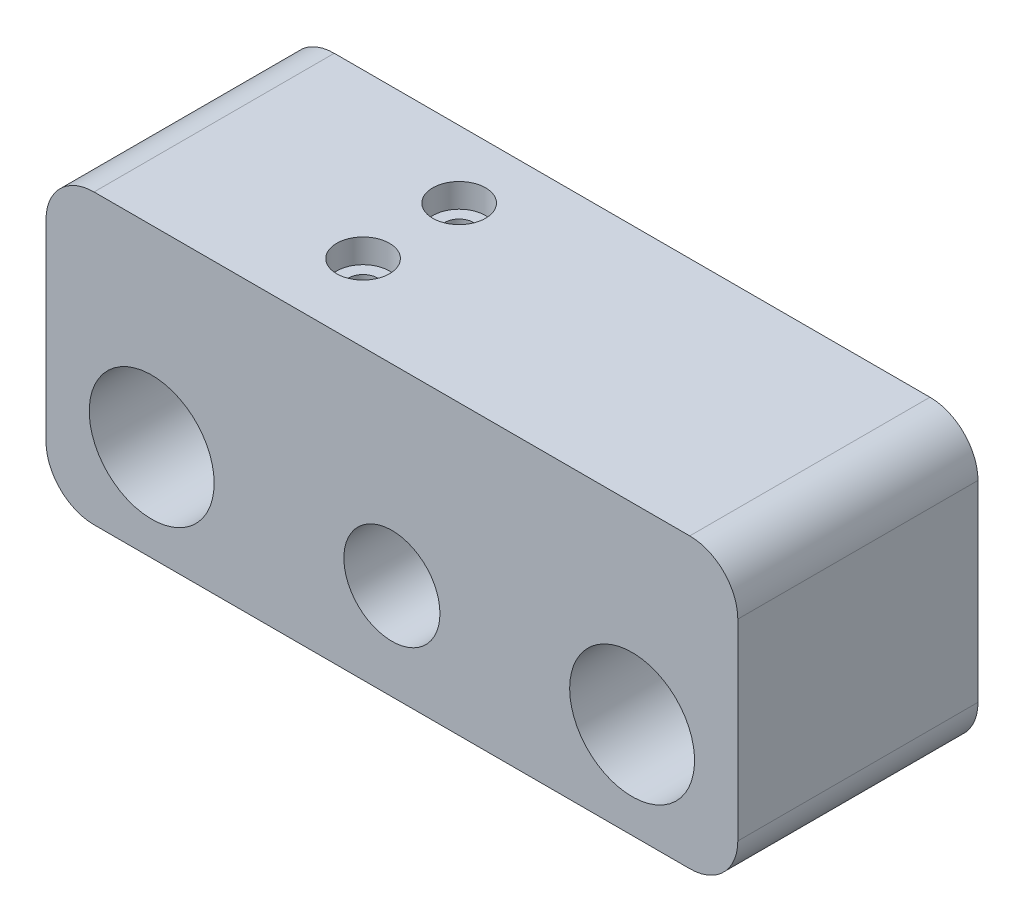
ISO-10303-21;
HEADER;
FILE_DESCRIPTION(('STEP AP214'),'2;1');
FILE_NAME('part.step','',(''),(''),'','','');
FILE_SCHEMA(('AUTOMOTIVE_DESIGN { 1 0 10303 214 1 1 1 1 }'));
ENDSEC;
DATA;
#1=APPLICATION_CONTEXT('core data for automotive mechanical design processes');
#2=APPLICATION_PROTOCOL_DEFINITION('international standard','automotive_design',2000,#1);
#3=PRODUCT_CONTEXT('',#1,'mechanical');
#4=PRODUCT('Part','Part','',(#3));
#5=PRODUCT_RELATED_PRODUCT_CATEGORY('part','',(#4));
#6=PRODUCT_DEFINITION_FORMATION('','',#4);
#7=PRODUCT_DEFINITION_CONTEXT('part definition',#1,'design');
#8=PRODUCT_DEFINITION('design','',#6,#7);
#9=PRODUCT_DEFINITION_SHAPE('','',#8);
#10=(LENGTH_UNIT() NAMED_UNIT(*) SI_UNIT(.MILLI.,.METRE.));
#11=(NAMED_UNIT(*) PLANE_ANGLE_UNIT() SI_UNIT($,.RADIAN.));
#12=(NAMED_UNIT(*) SI_UNIT($,.STERADIAN.) SOLID_ANGLE_UNIT());
#13=UNCERTAINTY_MEASURE_WITH_UNIT(LENGTH_MEASURE(1.E-05),#10,'distance_accuracy_value','');
#14=(GEOMETRIC_REPRESENTATION_CONTEXT(3) GLOBAL_UNCERTAINTY_ASSIGNED_CONTEXT((#13)) GLOBAL_UNIT_ASSIGNED_CONTEXT((#10,
#11,#12)) REPRESENTATION_CONTEXT('',''));
#15=CARTESIAN_POINT('',(0.,0.,0.));
#16=DIRECTION('',(0.,0.,1.));
#17=DIRECTION('',(1.,0.,0.));
#18=AXIS2_PLACEMENT_3D('',#15,#16,#17);
#19=CARTESIAN_POINT('',(-22.,40.001,14.));
#20=DIRECTION('',(0.,-1.,0.));
#21=DIRECTION('',(0.,0.,-1.));
#22=AXIS2_PLACEMENT_3D('',#19,#20,#21);
#23=CYLINDRICAL_SURFACE('',#22,3.);
#24=CARTESIAN_POINT('',(-22.,-20.,14.));
#25=DIRECTION('',(0.,-1.,0.));
#26=DIRECTION('',(0.,0.,-1.));
#27=AXIS2_PLACEMENT_3D('',#24,#25,#26);
#28=CIRCLE('',#27,3.);
#29=CARTESIAN_POINT('',(-22.,-20.,11.));
#30=VERTEX_POINT('',#29);
#31=EDGE_CURVE('E190',#30,#30,#28,.T.);
#32=ORIENTED_EDGE('',*,*,#31,.T.);
#33=EDGE_LOOP('',(#32));
#34=FACE_BOUND('',#33,.T.);
#35=CARTESIAN_POINT('',(-22.,35.,14.));
#36=DIRECTION('',(0.,1.,0.));
#37=DIRECTION('',(0.,0.,1.));
#38=AXIS2_PLACEMENT_3D('',#35,#36,#37);
#39=CIRCLE('',#38,3.);
#40=CARTESIAN_POINT('',(-22.,35.,17.));
#41=VERTEX_POINT('',#40);
#42=EDGE_CURVE('E38',#41,#41,#39,.F.);
#43=ORIENTED_EDGE('',*,*,#42,.F.);
#44=EDGE_LOOP('',(#43));
#45=FACE_BOUND('',#44,.T.);
#46=ADVANCED_FACE('F34',(#34,#45),#23,.F.);
#47=CARTESIAN_POINT('',(-22.,40.001,34.));
#48=DIRECTION('',(0.,-1.,0.));
#49=DIRECTION('',(0.,0.,-1.));
#50=AXIS2_PLACEMENT_3D('',#47,#48,#49);
#51=CYLINDRICAL_SURFACE('',#50,3.);
#52=CARTESIAN_POINT('',(-22.,-20.,34.));
#53=DIRECTION('',(0.,-1.,0.));
#54=DIRECTION('',(0.,0.,-1.));
#55=AXIS2_PLACEMENT_3D('',#52,#53,#54);
#56=CIRCLE('',#55,3.);
#57=CARTESIAN_POINT('',(-22.,-20.,31.));
#58=VERTEX_POINT('',#57);
#59=EDGE_CURVE('E125',#58,#58,#56,.T.);
#60=ORIENTED_EDGE('',*,*,#59,.T.);
#61=EDGE_LOOP('',(#60));
#62=FACE_BOUND('',#61,.T.);
#63=CARTESIAN_POINT('',(-22.,35.,34.));
#64=DIRECTION('',(0.,1.,0.));
#65=DIRECTION('',(0.,0.,1.));
#66=AXIS2_PLACEMENT_3D('',#63,#64,#65);
#67=CIRCLE('',#66,3.);
#68=CARTESIAN_POINT('',(-22.,35.,37.));
#69=VERTEX_POINT('',#68);
#70=EDGE_CURVE('E184',#69,#69,#67,.F.);
#71=ORIENTED_EDGE('',*,*,#70,.F.);
#72=EDGE_LOOP('',(#71));
#73=FACE_BOUND('',#72,.T.);
#74=ADVANCED_FACE('F230',(#62,#73),#51,.F.);
#75=CARTESIAN_POINT('',(-62.,-10.,50.));
#76=DIRECTION('',(0.,0.,1.));
#77=DIRECTION('',(1.,0.,0.));
#78=AXIS2_PLACEMENT_3D('',#75,#76,#77);
#79=CYLINDRICAL_SURFACE('',#78,10.);
#80=DIRECTION('',(0.,0.,1.));
#81=VECTOR('',#80,1.);
#82=CARTESIAN_POINT('',(-72.,-10.,50.));
#83=LINE('',#82,#81);
#84=CARTESIAN_POINT('',(-72.,-10.,0.));
#85=VERTEX_POINT('',#84);
#86=CARTESIAN_POINT('',(-72.,-10.,50.));
#87=VERTEX_POINT('',#86);
#88=EDGE_CURVE('E179',#85,#87,#83,.T.);
#89=ORIENTED_EDGE('',*,*,#88,.F.);
#90=CARTESIAN_POINT('',(-62.,-10.,0.));
#91=DIRECTION('',(0.,0.,-1.));
#92=DIRECTION('',(-1.,0.,0.));
#93=AXIS2_PLACEMENT_3D('',#90,#91,#92);
#94=CIRCLE('',#93,10.);
#95=CARTESIAN_POINT('',(-62.,-20.,0.));
#96=VERTEX_POINT('',#95);
#97=EDGE_CURVE('E43',#96,#85,#94,.T.);
#98=ORIENTED_EDGE('',*,*,#97,.F.);
#99=DIRECTION('',(0.,0.,1.));
#100=VECTOR('',#99,1.);
#101=CARTESIAN_POINT('',(-62.,-20.,-0.001000000000001));
#102=LINE('',#101,#100);
#103=CARTESIAN_POINT('',(-62.,-20.,50.));
#104=VERTEX_POINT('',#103);
#105=EDGE_CURVE('E182',#104,#96,#102,.F.);
#106=ORIENTED_EDGE('',*,*,#105,.F.);
#107=CARTESIAN_POINT('',(-62.,-10.,50.));
#108=DIRECTION('',(0.,0.,-1.));
#109=DIRECTION('',(-1.,0.,0.));
#110=AXIS2_PLACEMENT_3D('',#107,#108,#109);
#111=CIRCLE('',#110,10.);
#112=EDGE_CURVE('E11',#87,#104,#111,.F.);
#113=ORIENTED_EDGE('',*,*,#112,.F.);
#114=EDGE_LOOP('',(#89,#98,#106,#113));
#115=FACE_BOUND('',#114,.T.);
#116=ADVANCED_FACE('F36',(#115),#79,.T.);
#117=CARTESIAN_POINT('',(-62.,30.,50.));
#118=DIRECTION('',(0.,0.,1.));
#119=DIRECTION('',(1.,0.,0.));
#120=AXIS2_PLACEMENT_3D('',#117,#118,#119);
#121=CYLINDRICAL_SURFACE('',#120,10.);
#122=DIRECTION('',(0.,0.,1.));
#123=VECTOR('',#122,1.);
#124=CARTESIAN_POINT('',(-62.,40.,50.));
#125=LINE('',#124,#123);
#126=CARTESIAN_POINT('',(-62.,40.,0.));
#127=VERTEX_POINT('',#126);
#128=CARTESIAN_POINT('',(-62.,40.,50.));
#129=VERTEX_POINT('',#128);
#130=EDGE_CURVE('E169',#127,#129,#125,.T.);
#131=ORIENTED_EDGE('',*,*,#130,.F.);
#132=CARTESIAN_POINT('',(-62.,30.,0.));
#133=DIRECTION('',(0.,0.,-1.));
#134=DIRECTION('',(-1.,0.,0.));
#135=AXIS2_PLACEMENT_3D('',#132,#133,#134);
#136=CIRCLE('',#135,10.);
#137=CARTESIAN_POINT('',(-72.,30.,0.));
#138=VERTEX_POINT('',#137);
#139=EDGE_CURVE('E175',#138,#127,#136,.T.);
#140=ORIENTED_EDGE('',*,*,#139,.F.);
#141=DIRECTION('',(0.,0.,1.));
#142=VECTOR('',#141,1.);
#143=CARTESIAN_POINT('',(-72.,30.,50.));
#144=LINE('',#143,#142);
#145=CARTESIAN_POINT('',(-72.,30.,50.));
#146=VERTEX_POINT('',#145);
#147=EDGE_CURVE('E172',#146,#138,#144,.F.);
#148=ORIENTED_EDGE('',*,*,#147,.F.);
#149=CARTESIAN_POINT('',(-62.,30.,50.));
#150=DIRECTION('',(0.,0.,-1.));
#151=DIRECTION('',(-1.,0.,0.));
#152=AXIS2_PLACEMENT_3D('',#149,#150,#151);
#153=CIRCLE('',#152,10.);
#154=EDGE_CURVE('E177',#129,#146,#153,.F.);
#155=ORIENTED_EDGE('',*,*,#154,.F.);
#156=EDGE_LOOP('',(#131,#140,#148,#155));
#157=FACE_BOUND('',#156,.T.);
#158=ADVANCED_FACE('F287',(#157),#121,.T.);
#159=CARTESIAN_POINT('',(62.,30.,50.));
#160=DIRECTION('',(0.,0.,1.));
#161=DIRECTION('',(1.,0.,0.));
#162=AXIS2_PLACEMENT_3D('',#159,#160,#161);
#163=CYLINDRICAL_SURFACE('',#162,10.);
#164=DIRECTION('',(0.,0.,1.));
#165=VECTOR('',#164,1.);
#166=CARTESIAN_POINT('',(72.,30.,50.));
#167=LINE('',#166,#165);
#168=CARTESIAN_POINT('',(72.,30.,0.));
#169=VERTEX_POINT('',#168);
#170=CARTESIAN_POINT('',(72.,30.,50.));
#171=VERTEX_POINT('',#170);
#172=EDGE_CURVE('E108',#169,#171,#167,.T.);
#173=ORIENTED_EDGE('',*,*,#172,.F.);
#174=CARTESIAN_POINT('',(62.,30.,0.));
#175=DIRECTION('',(0.,0.,-1.));
#176=DIRECTION('',(-1.,0.,0.));
#177=AXIS2_PLACEMENT_3D('',#174,#175,#176);
#178=CIRCLE('',#177,10.);
#179=CARTESIAN_POINT('',(62.,40.,0.));
#180=VERTEX_POINT('',#179);
#181=EDGE_CURVE('E165',#180,#169,#178,.T.);
#182=ORIENTED_EDGE('',*,*,#181,.F.);
#183=DIRECTION('',(0.,0.,1.));
#184=VECTOR('',#183,1.);
#185=CARTESIAN_POINT('',(62.,40.,50.));
#186=LINE('',#185,#184);
#187=CARTESIAN_POINT('',(62.,40.,50.));
#188=VERTEX_POINT('',#187);
#189=EDGE_CURVE('E162',#188,#180,#186,.F.);
#190=ORIENTED_EDGE('',*,*,#189,.F.);
#191=CARTESIAN_POINT('',(62.,30.,50.));
#192=DIRECTION('',(0.,0.,-1.));
#193=DIRECTION('',(-1.,0.,0.));
#194=AXIS2_PLACEMENT_3D('',#191,#192,#193);
#195=CIRCLE('',#194,10.);
#196=EDGE_CURVE('E167',#171,#188,#195,.F.);
#197=ORIENTED_EDGE('',*,*,#196,.F.);
#198=EDGE_LOOP('',(#173,#182,#190,#197));
#199=FACE_BOUND('',#198,.T.);
#200=ADVANCED_FACE('F295',(#199),#163,.T.);
#201=CARTESIAN_POINT('',(62.,-10.,-0.001000000000001));
#202=DIRECTION('',(0.,0.,1.));
#203=DIRECTION('',(1.,0.,0.));
#204=AXIS2_PLACEMENT_3D('',#201,#202,#203);
#205=CYLINDRICAL_SURFACE('',#204,10.);
#206=DIRECTION('',(0.,0.,1.));
#207=VECTOR('',#206,1.);
#208=CARTESIAN_POINT('',(62.,-20.,-0.001000000000001));
#209=LINE('',#208,#207);
#210=CARTESIAN_POINT('',(62.,-20.,0.));
#211=VERTEX_POINT('',#210);
#212=CARTESIAN_POINT('',(62.,-20.,50.));
#213=VERTEX_POINT('',#212);
#214=EDGE_CURVE('E102',#211,#213,#209,.T.);
#215=ORIENTED_EDGE('',*,*,#214,.F.);
#216=CARTESIAN_POINT('',(62.,-10.,0.));
#217=DIRECTION('',(0.,0.,-1.));
#218=DIRECTION('',(-1.,0.,0.));
#219=AXIS2_PLACEMENT_3D('',#216,#217,#218);
#220=CIRCLE('',#219,10.);
#221=CARTESIAN_POINT('',(72.,-10.,0.));
#222=VERTEX_POINT('',#221);
#223=EDGE_CURVE('E109',#222,#211,#220,.T.);
#224=ORIENTED_EDGE('',*,*,#223,.F.);
#225=DIRECTION('',(0.,0.,1.));
#226=VECTOR('',#225,1.);
#227=CARTESIAN_POINT('',(72.,-10.,50.));
#228=LINE('',#227,#226);
#229=CARTESIAN_POINT('',(72.,-10.,50.));
#230=VERTEX_POINT('',#229);
#231=EDGE_CURVE('E105',#230,#222,#228,.F.);
#232=ORIENTED_EDGE('',*,*,#231,.F.);
#233=CARTESIAN_POINT('',(62.,-10.,50.));
#234=DIRECTION('',(0.,0.,-1.));
#235=DIRECTION('',(-1.,0.,0.));
#236=AXIS2_PLACEMENT_3D('',#233,#234,#235);
#237=CIRCLE('',#236,10.);
#238=EDGE_CURVE('E99',#213,#230,#237,.F.);
#239=ORIENTED_EDGE('',*,*,#238,.F.);
#240=EDGE_LOOP('',(#215,#224,#232,#239));
#241=FACE_BOUND('',#240,.T.);
#242=ADVANCED_FACE('F101',(#241),#205,.T.);
#243=CARTESIAN_POINT('',(72.,-40.,50.));
#244=DIRECTION('',(-1.,0.,0.));
#245=DIRECTION('',(0.,0.,1.));
#246=AXIS2_PLACEMENT_3D('',#243,#244,#245);
#247=PLANE('',#246);
#248=DIRECTION('',(0.,1.,0.));
#249=VECTOR('',#248,1.);
#250=CARTESIAN_POINT('',(72.,-40.,0.));
#251=LINE('',#250,#249);
#252=EDGE_CURVE('E141',#222,#169,#251,.T.);
#253=ORIENTED_EDGE('',*,*,#252,.T.);
#254=ORIENTED_EDGE('',*,*,#172,.T.);
#255=DIRECTION('',(0.,1.,0.));
#256=VECTOR('',#255,1.);
#257=CARTESIAN_POINT('',(72.,-40.,50.));
#258=LINE('',#257,#256);
#259=EDGE_CURVE('E144',#230,#171,#258,.T.);
#260=ORIENTED_EDGE('',*,*,#259,.F.);
#261=ORIENTED_EDGE('',*,*,#231,.T.);
#262=EDGE_LOOP('',(#253,#254,#260,#261));
#263=FACE_BOUND('',#262,.T.);
#264=ADVANCED_FACE('F312',(#263),#247,.F.);
#265=CARTESIAN_POINT('',(-72.,40.,50.));
#266=DIRECTION('',(0.,-1.,0.));
#267=DIRECTION('',(0.,0.,-1.));
#268=AXIS2_PLACEMENT_3D('',#265,#266,#267);
#269=PLANE('',#268);
#270=CARTESIAN_POINT('',(-22.,40.,14.));
#271=DIRECTION('',(0.,1.,0.));
#272=DIRECTION('',(0.,0.,1.));
#273=AXIS2_PLACEMENT_3D('',#270,#271,#272);
#274=CIRCLE('',#273,5.5);
#275=CARTESIAN_POINT('',(-22.,40.,19.5));
#276=VERTEX_POINT('',#275);
#277=EDGE_CURVE('E192',#276,#276,#274,.T.);
#278=ORIENTED_EDGE('',*,*,#277,.F.);
#279=EDGE_LOOP('',(#278));
#280=FACE_BOUND('',#279,.T.);
#281=CARTESIAN_POINT('',(-22.,40.,34.));
#282=DIRECTION('',(0.,1.,0.));
#283=DIRECTION('',(0.,0.,1.));
#284=AXIS2_PLACEMENT_3D('',#281,#282,#283);
#285=CIRCLE('',#284,5.5);
#286=CARTESIAN_POINT('',(-22.,40.,39.5));
#287=VERTEX_POINT('',#286);
#288=EDGE_CURVE('E202',#287,#287,#285,.T.);
#289=ORIENTED_EDGE('',*,*,#288,.F.);
#290=EDGE_LOOP('',(#289));
#291=FACE_BOUND('',#290,.T.);
#292=DIRECTION('',(-1.,0.,0.));
#293=VECTOR('',#292,1.);
#294=CARTESIAN_POINT('',(-72.,40.,0.));
#295=LINE('',#294,#293);
#296=EDGE_CURVE('E153',#180,#127,#295,.T.);
#297=ORIENTED_EDGE('',*,*,#296,.T.);
#298=ORIENTED_EDGE('',*,*,#130,.T.);
#299=DIRECTION('',(-1.,0.,0.));
#300=VECTOR('',#299,1.);
#301=CARTESIAN_POINT('',(-72.,40.,50.));
#302=LINE('',#301,#300);
#303=EDGE_CURVE('E146',#188,#129,#302,.T.);
#304=ORIENTED_EDGE('',*,*,#303,.F.);
#305=ORIENTED_EDGE('',*,*,#189,.T.);
#306=EDGE_LOOP('',(#297,#298,#304,#305));
#307=FACE_BOUND('',#306,.T.);
#308=ADVANCED_FACE('F362',(#280,#291,#307),#269,.F.);
#309=CARTESIAN_POINT('',(-72.,-40.,50.));
#310=DIRECTION('',(1.,0.,0.));
#311=DIRECTION('',(0.,0.,-1.));
#312=AXIS2_PLACEMENT_3D('',#309,#310,#311);
#313=PLANE('',#312);
#314=DIRECTION('',(0.,-1.,0.));
#315=VECTOR('',#314,1.);
#316=CARTESIAN_POINT('',(-72.,-40.,0.));
#317=LINE('',#316,#315);
#318=EDGE_CURVE('E147',#138,#85,#317,.T.);
#319=ORIENTED_EDGE('',*,*,#318,.T.);
#320=ORIENTED_EDGE('',*,*,#88,.T.);
#321=DIRECTION('',(0.,-1.,0.));
#322=VECTOR('',#321,1.);
#323=CARTESIAN_POINT('',(-72.,-40.,50.));
#324=LINE('',#323,#322);
#325=EDGE_CURVE('E117',#146,#87,#324,.T.);
#326=ORIENTED_EDGE('',*,*,#325,.F.);
#327=ORIENTED_EDGE('',*,*,#147,.T.);
#328=EDGE_LOOP('',(#319,#320,#326,#327));
#329=FACE_BOUND('',#328,.T.);
#330=ADVANCED_FACE('F354',(#329),#313,.F.);
#331=CARTESIAN_POINT('',(0.,0.,50.));
#332=DIRECTION('',(0.,0.,-1.));
#333=DIRECTION('',(-1.,0.,0.));
#334=AXIS2_PLACEMENT_3D('',#331,#332,#333);
#335=PLANE('',#334);
#336=CARTESIAN_POINT('',(50.,0.,50.));
#337=DIRECTION('',(0.,0.,1.));
#338=DIRECTION('',(-1.,0.,0.));
#339=AXIS2_PLACEMENT_3D('',#336,#337,#338);
#340=CIRCLE('',#339,13.);
#341=CARTESIAN_POINT('',(37.,0.,50.));
#342=VERTEX_POINT('',#341);
#343=EDGE_CURVE('E123',#342,#342,#340,.T.);
#344=ORIENTED_EDGE('',*,*,#343,.F.);
#345=EDGE_LOOP('',(#344));
#346=FACE_BOUND('',#345,.T.);
#347=CARTESIAN_POINT('',(-50.,0.,50.));
#348=DIRECTION('',(0.,0.,1.));
#349=DIRECTION('',(1.,0.,0.));
#350=AXIS2_PLACEMENT_3D('',#347,#348,#349);
#351=CIRCLE('',#350,13.);
#352=CARTESIAN_POINT('',(-37.,0.,50.));
#353=VERTEX_POINT('',#352);
#354=EDGE_CURVE('E129',#353,#353,#351,.T.);
#355=ORIENTED_EDGE('',*,*,#354,.F.);
#356=EDGE_LOOP('',(#355));
#357=FACE_BOUND('',#356,.T.);
#358=CARTESIAN_POINT('',(0.,0.,50.));
#359=DIRECTION('',(0.,0.,1.));
#360=DIRECTION('',(1.,0.,0.));
#361=AXIS2_PLACEMENT_3D('',#358,#359,#360);
#362=CIRCLE('',#361,10.);
#363=CARTESIAN_POINT('',(10.,0.,50.));
#364=VERTEX_POINT('',#363);
#365=EDGE_CURVE('E138',#364,#364,#362,.T.);
#366=ORIENTED_EDGE('',*,*,#365,.F.);
#367=EDGE_LOOP('',(#366));
#368=FACE_BOUND('',#367,.T.);
#369=ORIENTED_EDGE('',*,*,#325,.T.);
#370=ORIENTED_EDGE('',*,*,#112,.T.);
#371=DIRECTION('',(-1.,0.,0.));
#372=VECTOR('',#371,1.);
#373=CARTESIAN_POINT('',(-72.,-20.,50.));
#374=LINE('',#373,#372);
#375=EDGE_CURVE('E114',#213,#104,#374,.T.);
#376=ORIENTED_EDGE('',*,*,#375,.F.);
#377=ORIENTED_EDGE('',*,*,#238,.T.);
#378=ORIENTED_EDGE('',*,*,#259,.T.);
#379=ORIENTED_EDGE('',*,*,#196,.T.);
#380=ORIENTED_EDGE('',*,*,#303,.T.);
#381=ORIENTED_EDGE('',*,*,#154,.T.);
#382=EDGE_LOOP('',(#369,#370,#376,#377,#378,#379,#380,#381));
#383=FACE_BOUND('',#382,.T.);
#384=ADVANCED_FACE('F119',(#346,#357,#368,#383),#335,.F.);
#385=CARTESIAN_POINT('',(0.,0.,0.));
#386=DIRECTION('',(0.,0.,-1.));
#387=DIRECTION('',(-1.,0.,0.));
#388=AXIS2_PLACEMENT_3D('',#385,#386,#387);
#389=PLANE('',#388);
#390=DIRECTION('',(-1.,0.,0.));
#391=VECTOR('',#390,1.);
#392=CARTESIAN_POINT('',(-72.,-20.,0.));
#393=LINE('',#392,#391);
#394=EDGE_CURVE('E116',#211,#96,#393,.T.);
#395=ORIENTED_EDGE('',*,*,#394,.T.);
#396=ORIENTED_EDGE('',*,*,#97,.T.);
#397=ORIENTED_EDGE('',*,*,#318,.F.);
#398=ORIENTED_EDGE('',*,*,#139,.T.);
#399=ORIENTED_EDGE('',*,*,#296,.F.);
#400=ORIENTED_EDGE('',*,*,#181,.T.);
#401=ORIENTED_EDGE('',*,*,#252,.F.);
#402=ORIENTED_EDGE('',*,*,#223,.T.);
#403=EDGE_LOOP('',(#395,#396,#397,#398,#399,#400,#401,#402));
#404=FACE_BOUND('',#403,.T.);
#405=CARTESIAN_POINT('',(50.,0.,0.));
#406=DIRECTION('',(0.,0.,-1.));
#407=DIRECTION('',(-1.,0.,0.));
#408=AXIS2_PLACEMENT_3D('',#405,#406,#407);
#409=CIRCLE('',#408,13.);
#410=CARTESIAN_POINT('',(37.,0.,0.));
#411=VERTEX_POINT('',#410);
#412=EDGE_CURVE('E120',#411,#411,#409,.F.);
#413=ORIENTED_EDGE('',*,*,#412,.T.);
#414=EDGE_LOOP('',(#413));
#415=FACE_BOUND('',#414,.T.);
#416=CARTESIAN_POINT('',(-50.,0.,0.));
#417=DIRECTION('',(0.,0.,-1.));
#418=DIRECTION('',(-1.,0.,0.));
#419=AXIS2_PLACEMENT_3D('',#416,#417,#418);
#420=CIRCLE('',#419,13.);
#421=CARTESIAN_POINT('',(-63.,0.,0.));
#422=VERTEX_POINT('',#421);
#423=EDGE_CURVE('E133',#422,#422,#420,.F.);
#424=ORIENTED_EDGE('',*,*,#423,.T.);
#425=EDGE_LOOP('',(#424));
#426=FACE_BOUND('',#425,.T.);
#427=CARTESIAN_POINT('',(0.,0.,0.));
#428=DIRECTION('',(0.,0.,-1.));
#429=DIRECTION('',(-1.,0.,0.));
#430=AXIS2_PLACEMENT_3D('',#427,#428,#429);
#431=CIRCLE('',#430,10.);
#432=CARTESIAN_POINT('',(-10.,0.,0.));
#433=VERTEX_POINT('',#432);
#434=EDGE_CURVE('E132',#433,#433,#431,.F.);
#435=ORIENTED_EDGE('',*,*,#434,.T.);
#436=EDGE_LOOP('',(#435));
#437=FACE_BOUND('',#436,.T.);
#438=ADVANCED_FACE('F338',(#404,#415,#426,#437),#389,.T.);
#439=CARTESIAN_POINT('',(0.,0.,-0.001000000000001));
#440=DIRECTION('',(0.,0.,1.));
#441=DIRECTION('',(1.,0.,0.));
#442=AXIS2_PLACEMENT_3D('',#439,#440,#441);
#443=CYLINDRICAL_SURFACE('',#442,10.);
#444=ORIENTED_EDGE('',*,*,#434,.F.);
#445=EDGE_LOOP('',(#444));
#446=FACE_BOUND('',#445,.T.);
#447=ORIENTED_EDGE('',*,*,#365,.T.);
#448=EDGE_LOOP('',(#447));
#449=FACE_BOUND('',#448,.T.);
#450=ADVANCED_FACE('F330',(#446,#449),#443,.F.);
#451=CARTESIAN_POINT('',(-50.,0.,-0.001000000000001));
#452=DIRECTION('',(0.,0.,1.));
#453=DIRECTION('',(1.,0.,0.));
#454=AXIS2_PLACEMENT_3D('',#451,#452,#453);
#455=CYLINDRICAL_SURFACE('',#454,13.);
#456=ORIENTED_EDGE('',*,*,#423,.F.);
#457=EDGE_LOOP('',(#456));
#458=FACE_BOUND('',#457,.T.);
#459=ORIENTED_EDGE('',*,*,#354,.T.);
#460=EDGE_LOOP('',(#459));
#461=FACE_BOUND('',#460,.T.);
#462=ADVANCED_FACE('F223',(#458,#461),#455,.F.);
#463=CARTESIAN_POINT('',(50.,0.,-0.001000000000001));
#464=DIRECTION('',(0.,0.,1.));
#465=DIRECTION('',(1.,0.,0.));
#466=AXIS2_PLACEMENT_3D('',#463,#464,#465);
#467=CYLINDRICAL_SURFACE('',#466,13.);
#468=ORIENTED_EDGE('',*,*,#412,.F.);
#469=EDGE_LOOP('',(#468));
#470=FACE_BOUND('',#469,.T.);
#471=ORIENTED_EDGE('',*,*,#343,.T.);
#472=EDGE_LOOP('',(#471));
#473=FACE_BOUND('',#472,.T.);
#474=ADVANCED_FACE('F213',(#470,#473),#467,.F.);
#475=CARTESIAN_POINT('',(-72.,-20.,-0.001000000000001));
#476=DIRECTION('',(0.,1.,0.));
#477=DIRECTION('',(0.,0.,1.));
#478=AXIS2_PLACEMENT_3D('',#475,#476,#477);
#479=PLANE('',#478);
#480=ORIENTED_EDGE('',*,*,#59,.F.);
#481=EDGE_LOOP('',(#480));
#482=FACE_BOUND('',#481,.T.);
#483=ORIENTED_EDGE('',*,*,#31,.F.);
#484=EDGE_LOOP('',(#483));
#485=FACE_BOUND('',#484,.T.);
#486=ORIENTED_EDGE('',*,*,#375,.T.);
#487=ORIENTED_EDGE('',*,*,#105,.T.);
#488=ORIENTED_EDGE('',*,*,#394,.F.);
#489=ORIENTED_EDGE('',*,*,#214,.T.);
#490=EDGE_LOOP('',(#486,#487,#488,#489));
#491=FACE_BOUND('',#490,.T.);
#492=ADVANCED_FACE('F113',(#482,#485,#491),#479,.F.);
#493=CARTESIAN_POINT('',(-22.,35.,34.));
#494=DIRECTION('',(0.,1.,0.));
#495=DIRECTION('',(0.,0.,1.));
#496=AXIS2_PLACEMENT_3D('',#493,#494,#495);
#497=PLANE('',#496);
#498=CARTESIAN_POINT('',(-22.,35.,34.));
#499=DIRECTION('',(0.,1.,0.));
#500=DIRECTION('',(0.,0.,1.));
#501=AXIS2_PLACEMENT_3D('',#498,#499,#500);
#502=CIRCLE('',#501,5.5);
#503=CARTESIAN_POINT('',(-22.,35.,39.5));
#504=VERTEX_POINT('',#503);
#505=EDGE_CURVE('E197',#504,#504,#502,.T.);
#506=ORIENTED_EDGE('',*,*,#505,.T.);
#507=EDGE_LOOP('',(#506));
#508=FACE_BOUND('',#507,.T.);
#509=ORIENTED_EDGE('',*,*,#70,.T.);
#510=EDGE_LOOP('',(#509));
#511=FACE_BOUND('',#510,.T.);
#512=ADVANCED_FACE('F212',(#508,#511),#497,.T.);
#513=CARTESIAN_POINT('',(-22.,35.,34.));
#514=DIRECTION('',(0.,1.,0.));
#515=DIRECTION('',(0.,0.,1.));
#516=AXIS2_PLACEMENT_3D('',#513,#514,#515);
#517=CYLINDRICAL_SURFACE('',#516,5.5);
#518=ORIENTED_EDGE('',*,*,#505,.F.);
#519=EDGE_LOOP('',(#518));
#520=FACE_BOUND('',#519,.T.);
#521=ORIENTED_EDGE('',*,*,#288,.T.);
#522=EDGE_LOOP('',(#521));
#523=FACE_BOUND('',#522,.T.);
#524=ADVANCED_FACE('F220',(#520,#523),#517,.F.);
#525=CARTESIAN_POINT('',(-22.,35.,14.));
#526=DIRECTION('',(0.,1.,0.));
#527=DIRECTION('',(0.,0.,1.));
#528=AXIS2_PLACEMENT_3D('',#525,#526,#527);
#529=PLANE('',#528);
#530=CARTESIAN_POINT('',(-22.,35.,14.));
#531=DIRECTION('',(0.,1.,0.));
#532=DIRECTION('',(0.,0.,1.));
#533=AXIS2_PLACEMENT_3D('',#530,#531,#532);
#534=CIRCLE('',#533,5.5);
#535=CARTESIAN_POINT('',(-22.,35.,19.5));
#536=VERTEX_POINT('',#535);
#537=EDGE_CURVE('E186',#536,#536,#534,.T.);
#538=ORIENTED_EDGE('',*,*,#537,.T.);
#539=EDGE_LOOP('',(#538));
#540=FACE_BOUND('',#539,.T.);
#541=ORIENTED_EDGE('',*,*,#42,.T.);
#542=EDGE_LOOP('',(#541));
#543=FACE_BOUND('',#542,.T.);
#544=ADVANCED_FACE('F238',(#540,#543),#529,.T.);
#545=CARTESIAN_POINT('',(-22.,35.,14.));
#546=DIRECTION('',(0.,1.,0.));
#547=DIRECTION('',(0.,0.,1.));
#548=AXIS2_PLACEMENT_3D('',#545,#546,#547);
#549=CYLINDRICAL_SURFACE('',#548,5.5);
#550=ORIENTED_EDGE('',*,*,#537,.F.);
#551=EDGE_LOOP('',(#550));
#552=FACE_BOUND('',#551,.T.);
#553=ORIENTED_EDGE('',*,*,#277,.T.);
#554=EDGE_LOOP('',(#553));
#555=FACE_BOUND('',#554,.T.);
#556=ADVANCED_FACE('F241',(#552,#555),#549,.F.);
#557=CLOSED_SHELL('',(#46,#74,#116,#158,#200,#242,#264,#308,#330,#384,#438,#450,#462,#474,#492,
#512,#524,#544,#556));
#558=MANIFOLD_SOLID_BREP('B2',#557);
#559=ADVANCED_BREP_SHAPE_REPRESENTATION('',(#18,#558),#14);
#560=SHAPE_DEFINITION_REPRESENTATION(#9,#559);
ENDSEC;
END-ISO-10303-21;
